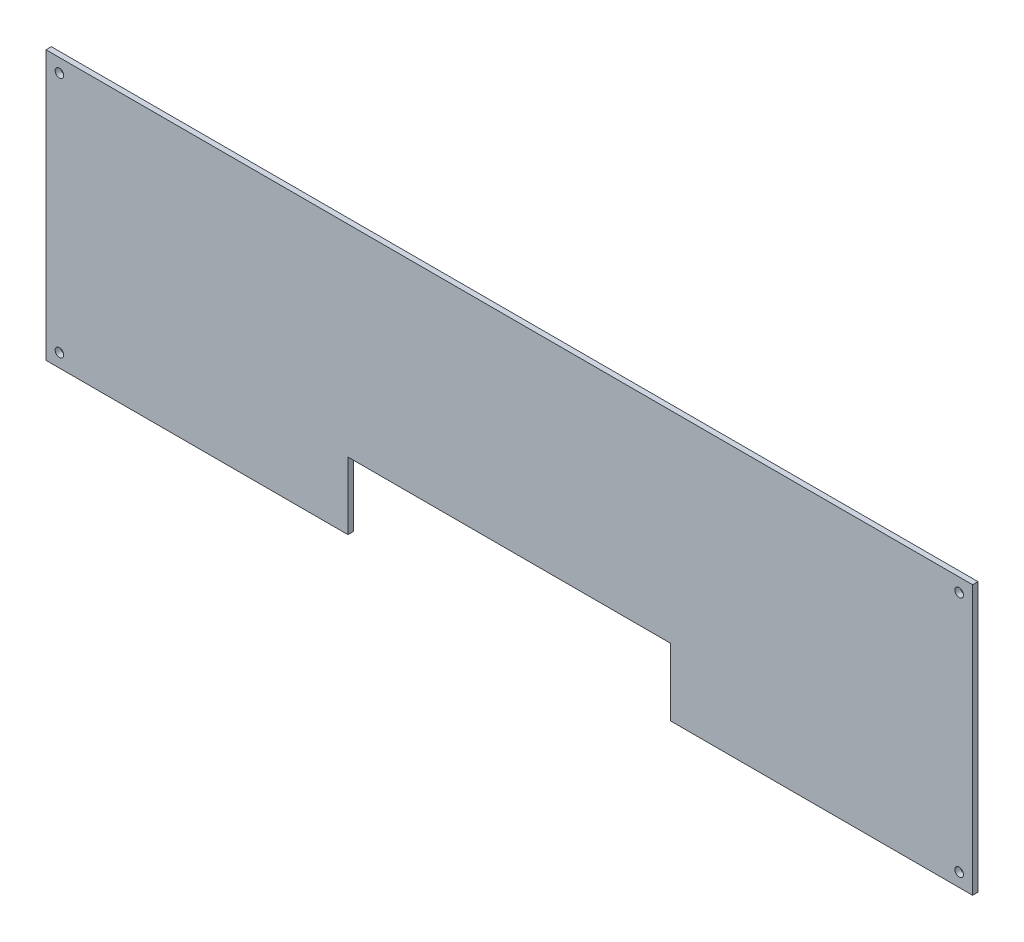
ISO-10303-21;
HEADER;
FILE_DESCRIPTION(('STEP AP214'),'2;1');
FILE_NAME('part.step','',(''),(''),'','','');
FILE_SCHEMA(('AUTOMOTIVE_DESIGN { 1 0 10303 214 1 1 1 1 }'));
ENDSEC;
DATA;
#1=APPLICATION_CONTEXT('core data for automotive mechanical design processes');
#2=APPLICATION_PROTOCOL_DEFINITION('international standard','automotive_design',2000,#1);
#3=PRODUCT_CONTEXT('',#1,'mechanical');
#4=PRODUCT('Part','Part','',(#3));
#5=PRODUCT_RELATED_PRODUCT_CATEGORY('part','',(#4));
#6=PRODUCT_DEFINITION_FORMATION('','',#4);
#7=PRODUCT_DEFINITION_CONTEXT('part definition',#1,'design');
#8=PRODUCT_DEFINITION('design','',#6,#7);
#9=PRODUCT_DEFINITION_SHAPE('','',#8);
#10=(LENGTH_UNIT() NAMED_UNIT(*) SI_UNIT(.MILLI.,.METRE.));
#11=(NAMED_UNIT(*) PLANE_ANGLE_UNIT() SI_UNIT($,.RADIAN.));
#12=(NAMED_UNIT(*) SI_UNIT($,.STERADIAN.) SOLID_ANGLE_UNIT());
#13=UNCERTAINTY_MEASURE_WITH_UNIT(LENGTH_MEASURE(1.E-05),#10,'distance_accuracy_value','');
#14=(GEOMETRIC_REPRESENTATION_CONTEXT(3) GLOBAL_UNCERTAINTY_ASSIGNED_CONTEXT((#13)) GLOBAL_UNIT_ASSIGNED_CONTEXT((#10,
#11,#12)) REPRESENTATION_CONTEXT('',''));
#15=CARTESIAN_POINT('',(0.,0.,0.));
#16=DIRECTION('',(0.,0.,1.));
#17=DIRECTION('',(1.,0.,0.));
#18=AXIS2_PLACEMENT_3D('',#15,#16,#17);
#19=CARTESIAN_POINT('',(-172.25,-50.,2.));
#20=DIRECTION('',(0.,1.,0.));
#21=DIRECTION('',(0.,0.,1.));
#22=AXIS2_PLACEMENT_3D('',#19,#20,#21);
#23=PLANE('',#22);
#24=DIRECTION('',(1.,0.,0.));
#25=VECTOR('',#24,1.);
#26=CARTESIAN_POINT('',(-172.25,-50.,2.));
#27=LINE('',#26,#25);
#28=CARTESIAN_POINT('',(60.,-50.,2.));
#29=VERTEX_POINT('',#28);
#30=CARTESIAN_POINT('',(172.25,-50.,2.));
#31=VERTEX_POINT('',#30);
#32=EDGE_CURVE('E59',#29,#31,#27,.T.);
#33=ORIENTED_EDGE('',*,*,#32,.F.);
#34=DIRECTION('',(0.,0.,1.));
#35=VECTOR('',#34,1.);
#36=CARTESIAN_POINT('',(60.,-50.,-8.));
#37=LINE('',#36,#35);
#38=CARTESIAN_POINT('',(60.,-50.,0.));
#39=VERTEX_POINT('',#38);
#40=EDGE_CURVE('E122',#39,#29,#37,.T.);
#41=ORIENTED_EDGE('',*,*,#40,.F.);
#42=DIRECTION('',(1.,0.,0.));
#43=VECTOR('',#42,1.);
#44=CARTESIAN_POINT('',(-172.25,-50.,0.));
#45=LINE('',#44,#43);
#46=CARTESIAN_POINT('',(172.25,-50.,0.));
#47=VERTEX_POINT('',#46);
#48=EDGE_CURVE('E81',#39,#47,#45,.T.);
#49=ORIENTED_EDGE('',*,*,#48,.T.);
#50=DIRECTION('',(0.,0.,-1.));
#51=VECTOR('',#50,1.);
#52=CARTESIAN_POINT('',(172.25,-50.,2.));
#53=LINE('',#52,#51);
#54=EDGE_CURVE('E168',#31,#47,#53,.T.);
#55=ORIENTED_EDGE('',*,*,#54,.F.);
#56=EDGE_LOOP('',(#33,#41,#49,#55));
#57=FACE_BOUND('',#56,.T.);
#58=ADVANCED_FACE('F35',(#57),#23,.F.);
#59=CARTESIAN_POINT('',(172.25,50.,2.));
#60=DIRECTION('',(-1.,0.,0.));
#61=DIRECTION('',(0.,-1.,0.));
#62=AXIS2_PLACEMENT_3D('',#59,#60,#61);
#63=PLANE('',#62);
#64=DIRECTION('',(0.,1.,0.));
#65=VECTOR('',#64,1.);
#66=CARTESIAN_POINT('',(172.25,50.,0.));
#67=LINE('',#66,#65);
#68=CARTESIAN_POINT('',(172.25,50.,0.));
#69=VERTEX_POINT('',#68);
#70=EDGE_CURVE('E157',#47,#69,#67,.T.);
#71=ORIENTED_EDGE('',*,*,#70,.T.);
#72=DIRECTION('',(0.,0.,-1.));
#73=VECTOR('',#72,1.);
#74=CARTESIAN_POINT('',(172.25,50.,2.));
#75=LINE('',#74,#73);
#76=CARTESIAN_POINT('',(172.25,50.,2.));
#77=VERTEX_POINT('',#76);
#78=EDGE_CURVE('E184',#77,#69,#75,.T.);
#79=ORIENTED_EDGE('',*,*,#78,.F.);
#80=DIRECTION('',(0.,1.,0.));
#81=VECTOR('',#80,1.);
#82=CARTESIAN_POINT('',(172.25,50.,2.));
#83=LINE('',#82,#81);
#84=EDGE_CURVE('E160',#31,#77,#83,.T.);
#85=ORIENTED_EDGE('',*,*,#84,.F.);
#86=ORIENTED_EDGE('',*,*,#54,.T.);
#87=EDGE_LOOP('',(#71,#79,#85,#86));
#88=FACE_BOUND('',#87,.T.);
#89=ADVANCED_FACE('F37',(#88),#63,.F.);
#90=CARTESIAN_POINT('',(-172.25,50.,2.));
#91=DIRECTION('',(0.,-1.,0.));
#92=DIRECTION('',(0.,0.,-1.));
#93=AXIS2_PLACEMENT_3D('',#90,#91,#92);
#94=PLANE('',#93);
#95=DIRECTION('',(-1.,0.,0.));
#96=VECTOR('',#95,1.);
#97=CARTESIAN_POINT('',(-172.25,50.,0.));
#98=LINE('',#97,#96);
#99=CARTESIAN_POINT('',(-172.25,50.,0.));
#100=VERTEX_POINT('',#99);
#101=EDGE_CURVE('E171',#69,#100,#98,.T.);
#102=ORIENTED_EDGE('',*,*,#101,.T.);
#103=DIRECTION('',(0.,0.,-1.));
#104=VECTOR('',#103,1.);
#105=CARTESIAN_POINT('',(-172.25,50.,2.));
#106=LINE('',#105,#104);
#107=CARTESIAN_POINT('',(-172.25,50.,2.));
#108=VERTEX_POINT('',#107);
#109=EDGE_CURVE('E181',#108,#100,#106,.T.);
#110=ORIENTED_EDGE('',*,*,#109,.F.);
#111=DIRECTION('',(-1.,0.,0.));
#112=VECTOR('',#111,1.);
#113=CARTESIAN_POINT('',(-172.25,50.,2.));
#114=LINE('',#113,#112);
#115=EDGE_CURVE('E89',#77,#108,#114,.T.);
#116=ORIENTED_EDGE('',*,*,#115,.F.);
#117=ORIENTED_EDGE('',*,*,#78,.T.);
#118=EDGE_LOOP('',(#102,#110,#116,#117));
#119=FACE_BOUND('',#118,.T.);
#120=ADVANCED_FACE('F202',(#119),#94,.F.);
#121=CARTESIAN_POINT('',(-172.25,50.,2.));
#122=DIRECTION('',(1.,0.,0.));
#123=DIRECTION('',(0.,0.,-1.));
#124=AXIS2_PLACEMENT_3D('',#121,#122,#123);
#125=PLANE('',#124);
#126=DIRECTION('',(0.,-1.,0.));
#127=VECTOR('',#126,1.);
#128=CARTESIAN_POINT('',(-172.25,50.,0.));
#129=LINE('',#128,#127);
#130=CARTESIAN_POINT('',(-172.25,-50.,0.));
#131=VERTEX_POINT('',#130);
#132=EDGE_CURVE('E173',#100,#131,#129,.T.);
#133=ORIENTED_EDGE('',*,*,#132,.T.);
#134=DIRECTION('',(0.,0.,-1.));
#135=VECTOR('',#134,1.);
#136=CARTESIAN_POINT('',(-172.25,-50.,2.));
#137=LINE('',#136,#135);
#138=CARTESIAN_POINT('',(-172.25,-50.,2.));
#139=VERTEX_POINT('',#138);
#140=EDGE_CURVE('E178',#139,#131,#137,.T.);
#141=ORIENTED_EDGE('',*,*,#140,.F.);
#142=DIRECTION('',(0.,-1.,0.));
#143=VECTOR('',#142,1.);
#144=CARTESIAN_POINT('',(-172.25,50.,2.));
#145=LINE('',#144,#143);
#146=EDGE_CURVE('E164',#108,#139,#145,.T.);
#147=ORIENTED_EDGE('',*,*,#146,.F.);
#148=ORIENTED_EDGE('',*,*,#109,.T.);
#149=EDGE_LOOP('',(#133,#141,#147,#148));
#150=FACE_BOUND('',#149,.T.);
#151=ADVANCED_FACE('F199',(#150),#125,.F.);
#152=CARTESIAN_POINT('',(-60.,-50.,0.));
#153=VERTEX_POINT('',#152);
#154=EDGE_CURVE('E162',#131,#153,#45,.T.);
#155=ORIENTED_EDGE('',*,*,#154,.T.);
#156=DIRECTION('',(0.,0.,1.));
#157=VECTOR('',#156,1.);
#158=CARTESIAN_POINT('',(-60.,-50.,-8.));
#159=LINE('',#158,#157);
#160=CARTESIAN_POINT('',(-60.,-50.,2.));
#161=VERTEX_POINT('',#160);
#162=EDGE_CURVE('E132',#153,#161,#159,.T.);
#163=ORIENTED_EDGE('',*,*,#162,.T.);
#164=EDGE_CURVE('E166',#139,#161,#27,.T.);
#165=ORIENTED_EDGE('',*,*,#164,.F.);
#166=ORIENTED_EDGE('',*,*,#140,.T.);
#167=EDGE_LOOP('',(#155,#163,#165,#166));
#168=FACE_BOUND('',#167,.T.);
#169=ADVANCED_FACE('F194',(#168),#23,.F.);
#170=CARTESIAN_POINT('',(0.,0.,2.));
#171=DIRECTION('',(0.,0.,1.));
#172=DIRECTION('',(1.,0.,0.));
#173=AXIS2_PLACEMENT_3D('',#170,#171,#172);
#174=PLANE('',#173);
#175=DIRECTION('',(0.,1.,0.));
#176=VECTOR('',#175,1.);
#177=CARTESIAN_POINT('',(60.,-25.,2.));
#178=LINE('',#177,#176);
#179=CARTESIAN_POINT('',(60.,-25.,2.));
#180=VERTEX_POINT('',#179);
#181=EDGE_CURVE('E120',#29,#180,#178,.T.);
#182=ORIENTED_EDGE('',*,*,#181,.F.);
#183=ORIENTED_EDGE('',*,*,#32,.T.);
#184=ORIENTED_EDGE('',*,*,#84,.T.);
#185=ORIENTED_EDGE('',*,*,#115,.T.);
#186=ORIENTED_EDGE('',*,*,#146,.T.);
#187=ORIENTED_EDGE('',*,*,#164,.T.);
#188=DIRECTION('',(0.,-1.,0.));
#189=VECTOR('',#188,1.);
#190=CARTESIAN_POINT('',(-60.,-25.,2.));
#191=LINE('',#190,#189);
#192=CARTESIAN_POINT('',(-60.,-25.,2.));
#193=VERTEX_POINT('',#192);
#194=EDGE_CURVE('E118',#193,#161,#191,.T.);
#195=ORIENTED_EDGE('',*,*,#194,.F.);
#196=DIRECTION('',(-1.,0.,0.));
#197=VECTOR('',#196,1.);
#198=CARTESIAN_POINT('',(-60.,-25.,2.));
#199=LINE('',#198,#197);
#200=EDGE_CURVE('E113',#180,#193,#199,.T.);
#201=ORIENTED_EDGE('',*,*,#200,.F.);
#202=EDGE_LOOP('',(#182,#183,#184,#185,#186,#187,#195,#201));
#203=FACE_BOUND('',#202,.T.);
#204=CARTESIAN_POINT('',(167.25,45.,2.));
#205=DIRECTION('',(0.,0.,1.));
#206=DIRECTION('',(-1.,0.,0.));
#207=AXIS2_PLACEMENT_3D('',#204,#205,#206);
#208=CIRCLE('',#207,1.59999999999999);
#209=CARTESIAN_POINT('',(165.65,45.,2.));
#210=VERTEX_POINT('',#209);
#211=EDGE_CURVE('E146',#210,#210,#208,.T.);
#212=ORIENTED_EDGE('',*,*,#211,.F.);
#213=EDGE_LOOP('',(#212));
#214=FACE_BOUND('',#213,.T.);
#215=CARTESIAN_POINT('',(-167.25,-45.,2.));
#216=DIRECTION('',(0.,0.,1.));
#217=DIRECTION('',(-1.,0.,0.));
#218=AXIS2_PLACEMENT_3D('',#215,#216,#217);
#219=CIRCLE('',#218,1.59999999999999);
#220=CARTESIAN_POINT('',(-168.85,-45.,2.));
#221=VERTEX_POINT('',#220);
#222=EDGE_CURVE('E139',#221,#221,#219,.T.);
#223=ORIENTED_EDGE('',*,*,#222,.F.);
#224=EDGE_LOOP('',(#223));
#225=FACE_BOUND('',#224,.T.);
#226=CARTESIAN_POINT('',(-167.25,45.,2.));
#227=DIRECTION('',(0.,0.,1.));
#228=DIRECTION('',(1.,0.,0.));
#229=AXIS2_PLACEMENT_3D('',#226,#227,#228);
#230=CIRCLE('',#229,1.59999999999999);
#231=CARTESIAN_POINT('',(-165.65,45.,2.));
#232=VERTEX_POINT('',#231);
#233=EDGE_CURVE('E131',#232,#232,#230,.T.);
#234=ORIENTED_EDGE('',*,*,#233,.F.);
#235=EDGE_LOOP('',(#234));
#236=FACE_BOUND('',#235,.T.);
#237=CARTESIAN_POINT('',(167.25,-45.,2.));
#238=DIRECTION('',(0.,0.,1.));
#239=DIRECTION('',(1.,0.,0.));
#240=AXIS2_PLACEMENT_3D('',#237,#238,#239);
#241=CIRCLE('',#240,1.59999999999999);
#242=CARTESIAN_POINT('',(168.85,-45.,2.));
#243=VERTEX_POINT('',#242);
#244=EDGE_CURVE('E145',#243,#243,#241,.T.);
#245=ORIENTED_EDGE('',*,*,#244,.F.);
#246=EDGE_LOOP('',(#245));
#247=FACE_BOUND('',#246,.T.);
#248=ADVANCED_FACE('F124',(#203,#214,#225,#236,#247),#174,.T.);
#249=CARTESIAN_POINT('',(0.,0.,0.));
#250=DIRECTION('',(0.,0.,1.));
#251=DIRECTION('',(1.,0.,0.));
#252=AXIS2_PLACEMENT_3D('',#249,#250,#251);
#253=PLANE('',#252);
#254=ORIENTED_EDGE('',*,*,#48,.F.);
#255=DIRECTION('',(0.,1.,0.));
#256=VECTOR('',#255,1.);
#257=CARTESIAN_POINT('',(60.,0.,0.));
#258=LINE('',#257,#256);
#259=CARTESIAN_POINT('',(60.,-25.,0.));
#260=VERTEX_POINT('',#259);
#261=EDGE_CURVE('E11',#39,#260,#258,.T.);
#262=ORIENTED_EDGE('',*,*,#261,.T.);
#263=DIRECTION('',(-1.,0.,0.));
#264=VECTOR('',#263,1.);
#265=CARTESIAN_POINT('',(0.,-25.,0.));
#266=LINE('',#265,#264);
#267=CARTESIAN_POINT('',(-60.,-25.,0.));
#268=VERTEX_POINT('',#267);
#269=EDGE_CURVE('E116',#260,#268,#266,.T.);
#270=ORIENTED_EDGE('',*,*,#269,.T.);
#271=DIRECTION('',(0.,-1.,0.));
#272=VECTOR('',#271,1.);
#273=CARTESIAN_POINT('',(-60.,0.,0.));
#274=LINE('',#273,#272);
#275=EDGE_CURVE('E43',#268,#153,#274,.T.);
#276=ORIENTED_EDGE('',*,*,#275,.T.);
#277=ORIENTED_EDGE('',*,*,#154,.F.);
#278=ORIENTED_EDGE('',*,*,#132,.F.);
#279=ORIENTED_EDGE('',*,*,#101,.F.);
#280=ORIENTED_EDGE('',*,*,#70,.F.);
#281=EDGE_LOOP('',(#254,#262,#270,#276,#277,#278,#279,#280));
#282=FACE_BOUND('',#281,.T.);
#283=CARTESIAN_POINT('',(167.25,45.,0.));
#284=DIRECTION('',(0.,0.,1.));
#285=DIRECTION('',(-1.,0.,0.));
#286=AXIS2_PLACEMENT_3D('',#283,#284,#285);
#287=CIRCLE('',#286,1.59999999999999);
#288=CARTESIAN_POINT('',(165.65,45.,0.));
#289=VERTEX_POINT('',#288);
#290=EDGE_CURVE('E142',#289,#289,#287,.T.);
#291=ORIENTED_EDGE('',*,*,#290,.T.);
#292=EDGE_LOOP('',(#291));
#293=FACE_BOUND('',#292,.T.);
#294=CARTESIAN_POINT('',(-167.25,-45.,0.));
#295=DIRECTION('',(0.,0.,1.));
#296=DIRECTION('',(-1.,0.,0.));
#297=AXIS2_PLACEMENT_3D('',#294,#295,#296);
#298=CIRCLE('',#297,1.59999999999999);
#299=CARTESIAN_POINT('',(-168.85,-45.,0.));
#300=VERTEX_POINT('',#299);
#301=EDGE_CURVE('E149',#300,#300,#298,.T.);
#302=ORIENTED_EDGE('',*,*,#301,.T.);
#303=EDGE_LOOP('',(#302));
#304=FACE_BOUND('',#303,.T.);
#305=CARTESIAN_POINT('',(-167.25,45.,0.));
#306=DIRECTION('',(0.,0.,1.));
#307=DIRECTION('',(1.,0.,0.));
#308=AXIS2_PLACEMENT_3D('',#305,#306,#307);
#309=CIRCLE('',#308,1.59999999999999);
#310=CARTESIAN_POINT('',(-165.65,45.,0.));
#311=VERTEX_POINT('',#310);
#312=EDGE_CURVE('E136',#311,#311,#309,.T.);
#313=ORIENTED_EDGE('',*,*,#312,.T.);
#314=EDGE_LOOP('',(#313));
#315=FACE_BOUND('',#314,.T.);
#316=CARTESIAN_POINT('',(167.25,-45.,0.));
#317=DIRECTION('',(0.,0.,1.));
#318=DIRECTION('',(1.,0.,0.));
#319=AXIS2_PLACEMENT_3D('',#316,#317,#318);
#320=CIRCLE('',#319,1.59999999999999);
#321=CARTESIAN_POINT('',(168.85,-45.,0.));
#322=VERTEX_POINT('',#321);
#323=EDGE_CURVE('E154',#322,#322,#320,.T.);
#324=ORIENTED_EDGE('',*,*,#323,.T.);
#325=EDGE_LOOP('',(#324));
#326=FACE_BOUND('',#325,.T.);
#327=ADVANCED_FACE('F189',(#282,#293,#304,#315,#326),#253,.F.);
#328=CARTESIAN_POINT('',(167.25,-45.,0.));
#329=DIRECTION('',(0.,0.,1.));
#330=DIRECTION('',(1.,0.,0.));
#331=AXIS2_PLACEMENT_3D('',#328,#329,#330);
#332=CYLINDRICAL_SURFACE('',#331,1.59999999999999);
#333=ORIENTED_EDGE('',*,*,#323,.F.);
#334=EDGE_LOOP('',(#333));
#335=FACE_BOUND('',#334,.T.);
#336=ORIENTED_EDGE('',*,*,#244,.T.);
#337=EDGE_LOOP('',(#336));
#338=FACE_BOUND('',#337,.T.);
#339=ADVANCED_FACE('F253',(#335,#338),#332,.F.);
#340=CARTESIAN_POINT('',(-167.25,45.,0.));
#341=DIRECTION('',(0.,0.,1.));
#342=DIRECTION('',(1.,0.,0.));
#343=AXIS2_PLACEMENT_3D('',#340,#341,#342);
#344=CYLINDRICAL_SURFACE('',#343,1.59999999999999);
#345=ORIENTED_EDGE('',*,*,#312,.F.);
#346=EDGE_LOOP('',(#345));
#347=FACE_BOUND('',#346,.T.);
#348=ORIENTED_EDGE('',*,*,#233,.T.);
#349=EDGE_LOOP('',(#348));
#350=FACE_BOUND('',#349,.T.);
#351=ADVANCED_FACE('F260',(#347,#350),#344,.F.);
#352=CARTESIAN_POINT('',(-167.25,-45.,0.));
#353=DIRECTION('',(0.,0.,1.));
#354=DIRECTION('',(1.,0.,0.));
#355=AXIS2_PLACEMENT_3D('',#352,#353,#354);
#356=CYLINDRICAL_SURFACE('',#355,1.59999999999999);
#357=ORIENTED_EDGE('',*,*,#301,.F.);
#358=EDGE_LOOP('',(#357));
#359=FACE_BOUND('',#358,.T.);
#360=ORIENTED_EDGE('',*,*,#222,.T.);
#361=EDGE_LOOP('',(#360));
#362=FACE_BOUND('',#361,.T.);
#363=ADVANCED_FACE('F269',(#359,#362),#356,.F.);
#364=CARTESIAN_POINT('',(167.25,45.,0.));
#365=DIRECTION('',(0.,0.,1.));
#366=DIRECTION('',(1.,0.,0.));
#367=AXIS2_PLACEMENT_3D('',#364,#365,#366);
#368=CYLINDRICAL_SURFACE('',#367,1.59999999999999);
#369=ORIENTED_EDGE('',*,*,#290,.F.);
#370=EDGE_LOOP('',(#369));
#371=FACE_BOUND('',#370,.T.);
#372=ORIENTED_EDGE('',*,*,#211,.T.);
#373=EDGE_LOOP('',(#372));
#374=FACE_BOUND('',#373,.T.);
#375=ADVANCED_FACE('F278',(#371,#374),#368,.F.);
#376=CARTESIAN_POINT('',(60.,-25.,-8.));
#377=DIRECTION('',(1.,0.,0.));
#378=DIRECTION('',(0.,0.,-1.));
#379=AXIS2_PLACEMENT_3D('',#376,#377,#378);
#380=PLANE('',#379);
#381=ORIENTED_EDGE('',*,*,#40,.T.);
#382=ORIENTED_EDGE('',*,*,#181,.T.);
#383=DIRECTION('',(0.,0.,1.));
#384=VECTOR('',#383,1.);
#385=CARTESIAN_POINT('',(60.,-25.,-8.));
#386=LINE('',#385,#384);
#387=EDGE_CURVE('E109',#260,#180,#386,.T.);
#388=ORIENTED_EDGE('',*,*,#387,.F.);
#389=ORIENTED_EDGE('',*,*,#261,.F.);
#390=EDGE_LOOP('',(#381,#382,#388,#389));
#391=FACE_BOUND('',#390,.T.);
#392=ADVANCED_FACE('F121',(#391),#380,.F.);
#393=CARTESIAN_POINT('',(-60.,-25.,-8.));
#394=DIRECTION('',(-1.,0.,0.));
#395=DIRECTION('',(0.,0.,1.));
#396=AXIS2_PLACEMENT_3D('',#393,#394,#395);
#397=PLANE('',#396);
#398=DIRECTION('',(0.,0.,1.));
#399=VECTOR('',#398,1.);
#400=CARTESIAN_POINT('',(-60.,-25.,-8.));
#401=LINE('',#400,#399);
#402=EDGE_CURVE('E50',#268,#193,#401,.T.);
#403=ORIENTED_EDGE('',*,*,#402,.T.);
#404=ORIENTED_EDGE('',*,*,#194,.T.);
#405=ORIENTED_EDGE('',*,*,#162,.F.);
#406=ORIENTED_EDGE('',*,*,#275,.F.);
#407=EDGE_LOOP('',(#403,#404,#405,#406));
#408=FACE_BOUND('',#407,.T.);
#409=ADVANCED_FACE('F298',(#408),#397,.F.);
#410=CARTESIAN_POINT('',(-60.,-25.,-8.));
#411=DIRECTION('',(0.,1.,0.));
#412=DIRECTION('',(0.,0.,1.));
#413=AXIS2_PLACEMENT_3D('',#410,#411,#412);
#414=PLANE('',#413);
#415=ORIENTED_EDGE('',*,*,#387,.T.);
#416=ORIENTED_EDGE('',*,*,#200,.T.);
#417=ORIENTED_EDGE('',*,*,#402,.F.);
#418=ORIENTED_EDGE('',*,*,#269,.F.);
#419=EDGE_LOOP('',(#415,#416,#417,#418));
#420=FACE_BOUND('',#419,.T.);
#421=ADVANCED_FACE('F111',(#420),#414,.F.);
#422=CLOSED_SHELL('',(#58,#89,#120,#151,#169,#248,#327,#339,#351,#363,#375,#392,#409,#421));
#423=MANIFOLD_SOLID_BREP('B2',#422);
#424=ADVANCED_BREP_SHAPE_REPRESENTATION('',(#18,#423),#14);
#425=SHAPE_DEFINITION_REPRESENTATION(#9,#424);
ENDSEC;
END-ISO-10303-21;
